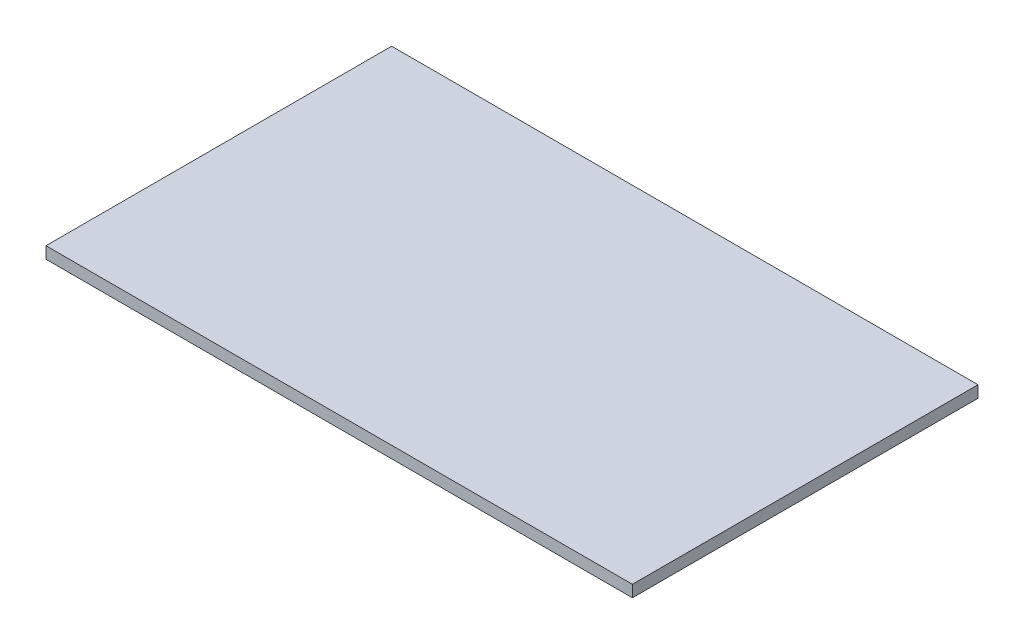
ISO-10303-21;
HEADER;
FILE_DESCRIPTION(('STEP AP214'),'2;1');
FILE_NAME('part.step','',(''),(''),'','','');
FILE_SCHEMA(('AUTOMOTIVE_DESIGN { 1 0 10303 214 1 1 1 1 }'));
ENDSEC;
DATA;
#1=APPLICATION_CONTEXT('core data for automotive mechanical design processes');
#2=APPLICATION_PROTOCOL_DEFINITION('international standard','automotive_design',2000,#1);
#3=PRODUCT_CONTEXT('',#1,'mechanical');
#4=PRODUCT('Part','Part','',(#3));
#5=PRODUCT_RELATED_PRODUCT_CATEGORY('part','',(#4));
#6=PRODUCT_DEFINITION_FORMATION('','',#4);
#7=PRODUCT_DEFINITION_CONTEXT('part definition',#1,'design');
#8=PRODUCT_DEFINITION('design','',#6,#7);
#9=PRODUCT_DEFINITION_SHAPE('','',#8);
#10=(LENGTH_UNIT() NAMED_UNIT(*) SI_UNIT(.MILLI.,.METRE.));
#11=(NAMED_UNIT(*) PLANE_ANGLE_UNIT() SI_UNIT($,.RADIAN.));
#12=(NAMED_UNIT(*) SI_UNIT($,.STERADIAN.) SOLID_ANGLE_UNIT());
#13=UNCERTAINTY_MEASURE_WITH_UNIT(LENGTH_MEASURE(1.E-05),#10,'distance_accuracy_value','');
#14=(GEOMETRIC_REPRESENTATION_CONTEXT(3) GLOBAL_UNCERTAINTY_ASSIGNED_CONTEXT((#13)) GLOBAL_UNIT_ASSIGNED_CONTEXT((#10,
#11,#12)) REPRESENTATION_CONTEXT('',''));
#15=CARTESIAN_POINT('',(0.,0.,0.));
#16=DIRECTION('',(0.,0.,1.));
#17=DIRECTION('',(1.,0.,0.));
#18=AXIS2_PLACEMENT_3D('',#15,#16,#17);
#19=CARTESIAN_POINT('',(2500.,100.,1473.4346556218));
#20=DIRECTION('',(-1.,0.,0.));
#21=DIRECTION('',(0.,0.,1.));
#22=AXIS2_PLACEMENT_3D('',#19,#20,#21);
#23=PLANE('',#22);
#24=DIRECTION('',(0.,0.,-1.));
#25=VECTOR('',#24,1.);
#26=CARTESIAN_POINT('',(2500.,0.,1473.4346556218));
#27=LINE('',#26,#25);
#28=CARTESIAN_POINT('',(2500.,0.,1473.4346556218));
#29=VERTEX_POINT('',#28);
#30=CARTESIAN_POINT('',(2500.,0.,-1473.4346556218));
#31=VERTEX_POINT('',#30);
#32=EDGE_CURVE('E110',#29,#31,#27,.T.);
#33=ORIENTED_EDGE('',*,*,#32,.T.);
#34=DIRECTION('',(0.,-1.,0.));
#35=VECTOR('',#34,1.);
#36=CARTESIAN_POINT('',(2500.,100.,-1473.4346556218));
#37=LINE('',#36,#35);
#38=CARTESIAN_POINT('',(2500.,100.,-1473.4346556218));
#39=VERTEX_POINT('',#38);
#40=EDGE_CURVE('E11',#39,#31,#37,.T.);
#41=ORIENTED_EDGE('',*,*,#40,.F.);
#42=DIRECTION('',(0.,0.,-1.));
#43=VECTOR('',#42,1.);
#44=CARTESIAN_POINT('',(2500.,100.,1473.4346556218));
#45=LINE('',#44,#43);
#46=CARTESIAN_POINT('',(2500.,100.,1473.4346556218));
#47=VERTEX_POINT('',#46);
#48=EDGE_CURVE('E98',#47,#39,#45,.T.);
#49=ORIENTED_EDGE('',*,*,#48,.F.);
#50=DIRECTION('',(0.,-1.,0.));
#51=VECTOR('',#50,1.);
#52=CARTESIAN_POINT('',(2500.,100.,1473.4346556218));
#53=LINE('',#52,#51);
#54=EDGE_CURVE('E106',#47,#29,#53,.T.);
#55=ORIENTED_EDGE('',*,*,#54,.T.);
#56=EDGE_LOOP('',(#33,#41,#49,#55));
#57=FACE_BOUND('',#56,.T.);
#58=ADVANCED_FACE('F47',(#57),#23,.F.);
#59=CARTESIAN_POINT('',(-2500.,100.,-1473.4346556218));
#60=DIRECTION('',(0.,0.,1.));
#61=DIRECTION('',(1.,0.,0.));
#62=AXIS2_PLACEMENT_3D('',#59,#60,#61);
#63=PLANE('',#62);
#64=DIRECTION('',(-1.,0.,0.));
#65=VECTOR('',#64,1.);
#66=CARTESIAN_POINT('',(-2500.,0.,-1473.4346556218));
#67=LINE('',#66,#65);
#68=CARTESIAN_POINT('',(-2500.,0.,-1473.4346556218));
#69=VERTEX_POINT('',#68);
#70=EDGE_CURVE('E102',#31,#69,#67,.T.);
#71=ORIENTED_EDGE('',*,*,#70,.T.);
#72=DIRECTION('',(0.,-1.,0.));
#73=VECTOR('',#72,1.);
#74=CARTESIAN_POINT('',(-2500.,100.,-1473.4346556218));
#75=LINE('',#74,#73);
#76=CARTESIAN_POINT('',(-2500.,100.,-1473.4346556218));
#77=VERTEX_POINT('',#76);
#78=EDGE_CURVE('E55',#77,#69,#75,.T.);
#79=ORIENTED_EDGE('',*,*,#78,.F.);
#80=DIRECTION('',(-1.,0.,0.));
#81=VECTOR('',#80,1.);
#82=CARTESIAN_POINT('',(-2500.,100.,-1473.4346556218));
#83=LINE('',#82,#81);
#84=EDGE_CURVE('E93',#39,#77,#83,.T.);
#85=ORIENTED_EDGE('',*,*,#84,.F.);
#86=ORIENTED_EDGE('',*,*,#40,.T.);
#87=EDGE_LOOP('',(#71,#79,#85,#86));
#88=FACE_BOUND('',#87,.T.);
#89=ADVANCED_FACE('F101',(#88),#63,.F.);
#90=CARTESIAN_POINT('',(-2500.,100.,1473.4346556218));
#91=DIRECTION('',(1.,0.,0.));
#92=DIRECTION('',(0.,0.,-1.));
#93=AXIS2_PLACEMENT_3D('',#90,#91,#92);
#94=PLANE('',#93);
#95=DIRECTION('',(0.,0.,1.));
#96=VECTOR('',#95,1.);
#97=CARTESIAN_POINT('',(-2500.,0.,1473.4346556218));
#98=LINE('',#97,#96);
#99=CARTESIAN_POINT('',(-2500.,0.,1473.4346556218));
#100=VERTEX_POINT('',#99);
#101=EDGE_CURVE('E80',#69,#100,#98,.T.);
#102=ORIENTED_EDGE('',*,*,#101,.T.);
#103=DIRECTION('',(0.,-1.,0.));
#104=VECTOR('',#103,1.);
#105=CARTESIAN_POINT('',(-2500.,100.,1473.4346556218));
#106=LINE('',#105,#104);
#107=CARTESIAN_POINT('',(-2500.,100.,1473.4346556218));
#108=VERTEX_POINT('',#107);
#109=EDGE_CURVE('E103',#108,#100,#106,.T.);
#110=ORIENTED_EDGE('',*,*,#109,.F.);
#111=DIRECTION('',(0.,0.,1.));
#112=VECTOR('',#111,1.);
#113=CARTESIAN_POINT('',(-2500.,100.,1473.4346556218));
#114=LINE('',#113,#112);
#115=EDGE_CURVE('E96',#77,#108,#114,.T.);
#116=ORIENTED_EDGE('',*,*,#115,.F.);
#117=ORIENTED_EDGE('',*,*,#78,.T.);
#118=EDGE_LOOP('',(#102,#110,#116,#117));
#119=FACE_BOUND('',#118,.T.);
#120=ADVANCED_FACE('F104',(#119),#94,.F.);
#121=CARTESIAN_POINT('',(-2500.,100.,1473.4346556218));
#122=DIRECTION('',(0.,0.,-1.));
#123=DIRECTION('',(-1.,0.,0.));
#124=AXIS2_PLACEMENT_3D('',#121,#122,#123);
#125=PLANE('',#124);
#126=DIRECTION('',(1.,0.,0.));
#127=VECTOR('',#126,1.);
#128=CARTESIAN_POINT('',(-2500.,0.,1473.4346556218));
#129=LINE('',#128,#127);
#130=EDGE_CURVE('E86',#100,#29,#129,.T.);
#131=ORIENTED_EDGE('',*,*,#130,.T.);
#132=ORIENTED_EDGE('',*,*,#54,.F.);
#133=DIRECTION('',(1.,0.,0.));
#134=VECTOR('',#133,1.);
#135=CARTESIAN_POINT('',(-2500.,100.,1473.4346556218));
#136=LINE('',#135,#134);
#137=EDGE_CURVE('E63',#108,#47,#136,.T.);
#138=ORIENTED_EDGE('',*,*,#137,.F.);
#139=ORIENTED_EDGE('',*,*,#109,.T.);
#140=EDGE_LOOP('',(#131,#132,#138,#139));
#141=FACE_BOUND('',#140,.T.);
#142=ADVANCED_FACE('F117',(#141),#125,.F.);
#143=CARTESIAN_POINT('',(0.,100.,0.));
#144=DIRECTION('',(0.,-1.,0.));
#145=DIRECTION('',(0.,0.,-1.));
#146=AXIS2_PLACEMENT_3D('',#143,#144,#145);
#147=PLANE('',#146);
#148=ORIENTED_EDGE('',*,*,#48,.T.);
#149=ORIENTED_EDGE('',*,*,#84,.T.);
#150=ORIENTED_EDGE('',*,*,#115,.T.);
#151=ORIENTED_EDGE('',*,*,#137,.T.);
#152=EDGE_LOOP('',(#148,#149,#150,#151));
#153=FACE_BOUND('',#152,.T.);
#154=ADVANCED_FACE('F94',(#153),#147,.F.);
#155=CARTESIAN_POINT('',(0.,0.,0.));
#156=DIRECTION('',(0.,-1.,0.));
#157=DIRECTION('',(0.,0.,-1.));
#158=AXIS2_PLACEMENT_3D('',#155,#156,#157);
#159=PLANE('',#158);
#160=ORIENTED_EDGE('',*,*,#32,.F.);
#161=ORIENTED_EDGE('',*,*,#130,.F.);
#162=ORIENTED_EDGE('',*,*,#101,.F.);
#163=ORIENTED_EDGE('',*,*,#70,.F.);
#164=EDGE_LOOP('',(#160,#161,#162,#163));
#165=FACE_BOUND('',#164,.T.);
#166=ADVANCED_FACE('F120',(#165),#159,.T.);
#167=CLOSED_SHELL('',(#58,#89,#120,#142,#154,#166));
#168=MANIFOLD_SOLID_BREP('B2',#167);
#169=ADVANCED_BREP_SHAPE_REPRESENTATION('',(#18,#168),#14);
#170=SHAPE_DEFINITION_REPRESENTATION(#9,#169);
ENDSEC;
END-ISO-10303-21;
